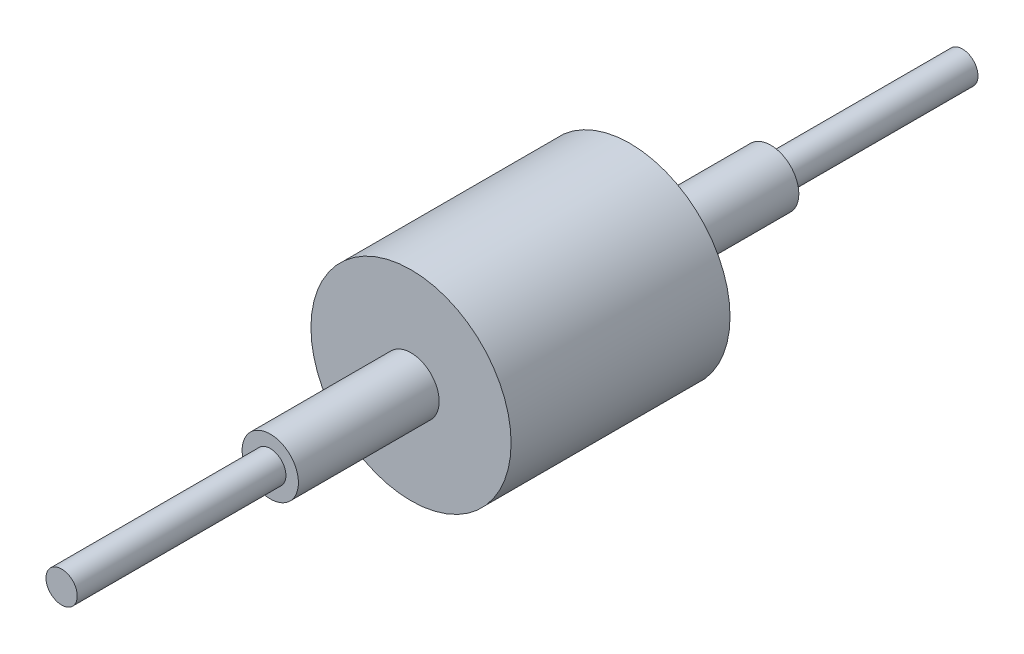
ISO-10303-21;
HEADER;
FILE_DESCRIPTION(('STEP AP214'),'2;1');
FILE_NAME('part.step','',(''),(''),'','','');
FILE_SCHEMA(('AUTOMOTIVE_DESIGN { 1 0 10303 214 1 1 1 1 }'));
ENDSEC;
DATA;
#1=APPLICATION_CONTEXT('core data for automotive mechanical design processes');
#2=APPLICATION_PROTOCOL_DEFINITION('international standard','automotive_design',2000,#1);
#3=PRODUCT_CONTEXT('',#1,'mechanical');
#4=PRODUCT('Part','Part','',(#3));
#5=PRODUCT_RELATED_PRODUCT_CATEGORY('part','',(#4));
#6=PRODUCT_DEFINITION_FORMATION('','',#4);
#7=PRODUCT_DEFINITION_CONTEXT('part definition',#1,'design');
#8=PRODUCT_DEFINITION('design','',#6,#7);
#9=PRODUCT_DEFINITION_SHAPE('','',#8);
#10=(LENGTH_UNIT() NAMED_UNIT(*) SI_UNIT(.MILLI.,.METRE.));
#11=(NAMED_UNIT(*) PLANE_ANGLE_UNIT() SI_UNIT($,.RADIAN.));
#12=(NAMED_UNIT(*) SI_UNIT($,.STERADIAN.) SOLID_ANGLE_UNIT());
#13=UNCERTAINTY_MEASURE_WITH_UNIT(LENGTH_MEASURE(1.E-05),#10,'distance_accuracy_value','');
#14=(GEOMETRIC_REPRESENTATION_CONTEXT(3) GLOBAL_UNCERTAINTY_ASSIGNED_CONTEXT((#13)) GLOBAL_UNIT_ASSIGNED_CONTEXT((#10,
#11,#12)) REPRESENTATION_CONTEXT('',''));
#15=CARTESIAN_POINT('',(0.,0.,0.));
#16=DIRECTION('',(0.,0.,1.));
#17=DIRECTION('',(1.,0.,0.));
#18=AXIS2_PLACEMENT_3D('',#15,#16,#17);
#19=CARTESIAN_POINT('',(3.571875,0.,-4.35704555792125));
#20=DIRECTION('',(0.,0.,-1.));
#21=DIRECTION('',(-1.,0.,0.));
#22=AXIS2_PLACEMENT_3D('',#19,#20,#21);
#23=PLANE('',#22);
#24=CARTESIAN_POINT('',(0.,0.,-4.35704555792116));
#25=DIRECTION('',(0.,0.,1.));
#26=DIRECTION('',(1.,0.,0.));
#27=AXIS2_PLACEMENT_3D('',#24,#25,#26);
#28=CIRCLE('',#27,3.57187500000001);
#29=CARTESIAN_POINT('',(3.571875,0.,-4.35704555792117));
#30=VERTEX_POINT('',#29);
#31=EDGE_CURVE('E10',#30,#30,#28,.T.);
#32=ORIENTED_EDGE('',*,*,#31,.T.);
#33=EDGE_LOOP('',(#32));
#34=FACE_BOUND('',#33,.T.);
#35=CARTESIAN_POINT('',(0.,0.,-4.35704555792116));
#36=DIRECTION('',(0.,0.,1.));
#37=DIRECTION('',(1.,0.,0.));
#38=AXIS2_PLACEMENT_3D('',#35,#36,#37);
#39=CIRCLE('',#38,12.7);
#40=CARTESIAN_POINT('',(12.7,0.,-4.3570455579212));
#41=VERTEX_POINT('',#40);
#42=EDGE_CURVE('E66',#41,#41,#39,.T.);
#43=ORIENTED_EDGE('',*,*,#42,.F.);
#44=EDGE_LOOP('',(#43));
#45=FACE_BOUND('',#44,.T.);
#46=ADVANCED_FACE('F32',(#34,#45),#23,.T.);
#47=CARTESIAN_POINT('',(3.49495078579509E-12,0.,1000.));
#48=DIRECTION('',(0.,0.,1.));
#49=DIRECTION('',(1.,0.,0.));
#50=AXIS2_PLACEMENT_3D('',#47,#48,#49);
#51=CYLINDRICAL_SURFACE('',#50,3.57187500000004);
#52=CARTESIAN_POINT('',(0.,0.,-22.2164205579212));
#53=DIRECTION('',(0.,0.,1.));
#54=DIRECTION('',(1.,0.,0.));
#55=AXIS2_PLACEMENT_3D('',#52,#53,#54);
#56=CIRCLE('',#55,3.57187500000007);
#57=CARTESIAN_POINT('',(3.571875,0.,-22.2164205579212));
#58=VERTEX_POINT('',#57);
#59=EDGE_CURVE('E38',#58,#58,#56,.T.);
#60=ORIENTED_EDGE('',*,*,#59,.T.);
#61=EDGE_LOOP('',(#60));
#62=FACE_BOUND('',#61,.T.);
#63=ORIENTED_EDGE('',*,*,#31,.F.);
#64=EDGE_LOOP('',(#63));
#65=FACE_BOUND('',#64,.T.);
#66=ADVANCED_FACE('F74',(#62,#65),#51,.T.);
#67=CARTESIAN_POINT('',(1.98437499999673,0.,-22.2164205579213));
#68=DIRECTION('',(0.,0.,-1.));
#69=DIRECTION('',(-1.,0.,0.));
#70=AXIS2_PLACEMENT_3D('',#67,#68,#69);
#71=PLANE('',#70);
#72=CARTESIAN_POINT('',(0.,0.,-22.2164205579212));
#73=DIRECTION('',(0.,0.,1.));
#74=DIRECTION('',(1.,0.,0.));
#75=AXIS2_PLACEMENT_3D('',#72,#73,#74);
#76=CIRCLE('',#75,1.9843749999968);
#77=CARTESIAN_POINT('',(1.98437499999673,0.,-22.2164205579212));
#78=VERTEX_POINT('',#77);
#79=EDGE_CURVE('E42',#78,#78,#76,.T.);
#80=ORIENTED_EDGE('',*,*,#79,.T.);
#81=EDGE_LOOP('',(#80));
#82=FACE_BOUND('',#81,.T.);
#83=ORIENTED_EDGE('',*,*,#59,.F.);
#84=EDGE_LOOP('',(#83));
#85=FACE_BOUND('',#84,.T.);
#86=ADVANCED_FACE('F78',(#82,#85),#71,.T.);
#87=CARTESIAN_POINT('',(3.49495078579509E-12,0.,1000.));
#88=DIRECTION('',(0.,0.,1.));
#89=DIRECTION('',(1.,0.,0.));
#90=AXIS2_PLACEMENT_3D('',#87,#88,#89);
#91=CYLINDRICAL_SURFACE('',#90,1.98437499999685);
#92=CARTESIAN_POINT('',(-1.59016779902279E-13,0.,-46.5379049993924));
#93=DIRECTION('',(0.,0.,1.));
#94=DIRECTION('',(1.,0.,0.));
#95=AXIS2_PLACEMENT_3D('',#92,#93,#94);
#96=CIRCLE('',#95,1.9843749999969);
#97=CARTESIAN_POINT('',(1.98437499999674,0.,-46.5379049993924));
#98=VERTEX_POINT('',#97);
#99=EDGE_CURVE('E46',#98,#98,#96,.T.);
#100=ORIENTED_EDGE('',*,*,#99,.T.);
#101=EDGE_LOOP('',(#100));
#102=FACE_BOUND('',#101,.T.);
#103=ORIENTED_EDGE('',*,*,#79,.F.);
#104=EDGE_LOOP('',(#103));
#105=FACE_BOUND('',#104,.T.);
#106=ADVANCED_FACE('F82',(#102,#105),#91,.T.);
#107=CARTESIAN_POINT('',(1.98437499999674,0.,-46.5379049993923));
#108=DIRECTION('',(0.,0.,-1.));
#109=DIRECTION('',(-1.,0.,0.));
#110=AXIS2_PLACEMENT_3D('',#107,#108,#109);
#111=PLANE('',#110);
#112=ORIENTED_EDGE('',*,*,#99,.F.);
#113=EDGE_LOOP('',(#112));
#114=FACE_BOUND('',#113,.T.);
#115=ADVANCED_FACE('F89',(#114),#111,.T.);
#116=CARTESIAN_POINT('',(0.,0.,67.7620950006077));
#117=DIRECTION('',(0.,0.,1.));
#118=DIRECTION('',(1.,0.,0.));
#119=AXIS2_PLACEMENT_3D('',#116,#117,#118);
#120=PLANE('',#119);
#121=CARTESIAN_POINT('',(2.40059537127491E-13,0.,67.7620950006077));
#122=DIRECTION('',(0.,0.,1.));
#123=DIRECTION('',(1.,0.,0.));
#124=AXIS2_PLACEMENT_3D('',#121,#122,#123);
#125=CIRCLE('',#124,1.98437499999977);
#126=CARTESIAN_POINT('',(1.98437500000001,0.,67.7620950006077));
#127=VERTEX_POINT('',#126);
#128=EDGE_CURVE('E51',#127,#127,#125,.T.);
#129=ORIENTED_EDGE('',*,*,#128,.T.);
#130=EDGE_LOOP('',(#129));
#131=FACE_BOUND('',#130,.T.);
#132=ADVANCED_FACE('F93',(#131),#120,.T.);
#133=CARTESIAN_POINT('',(3.49495078579509E-12,0.,1000.));
#134=DIRECTION('',(0.,0.,1.));
#135=DIRECTION('',(1.,0.,0.));
#136=AXIS2_PLACEMENT_3D('',#133,#134,#135);
#137=CYLINDRICAL_SURFACE('',#136,1.98437499999982);
#138=CARTESIAN_POINT('',(1.4761029417462E-13,0.,41.2835794420787));
#139=DIRECTION('',(0.,0.,1.));
#140=DIRECTION('',(1.,0.,0.));
#141=AXIS2_PLACEMENT_3D('',#138,#139,#140);
#142=CIRCLE('',#141,1.98437499999986);
#143=CARTESIAN_POINT('',(1.98437500000001,0.,41.2835794420787));
#144=VERTEX_POINT('',#143);
#145=EDGE_CURVE('E54',#144,#144,#142,.T.);
#146=ORIENTED_EDGE('',*,*,#145,.T.);
#147=EDGE_LOOP('',(#146));
#148=FACE_BOUND('',#147,.T.);
#149=ORIENTED_EDGE('',*,*,#128,.F.);
#150=EDGE_LOOP('',(#149));
#151=FACE_BOUND('',#150,.T.);
#152=ADVANCED_FACE('F97',(#148,#151),#137,.T.);
#153=CARTESIAN_POINT('',(1.98437500000001,0.,41.2835794420787));
#154=DIRECTION('',(0.,0.,1.));
#155=DIRECTION('',(1.,0.,0.));
#156=AXIS2_PLACEMENT_3D('',#153,#154,#155);
#157=PLANE('',#156);
#158=CARTESIAN_POINT('',(1.4761029417462E-13,0.,41.2835794420787));
#159=DIRECTION('',(0.,0.,1.));
#160=DIRECTION('',(1.,0.,0.));
#161=AXIS2_PLACEMENT_3D('',#158,#159,#160);
#162=CIRCLE('',#161,3.57187499999985);
#163=CARTESIAN_POINT('',(3.571875,0.,41.2835794420787));
#164=VERTEX_POINT('',#163);
#165=EDGE_CURVE('E57',#164,#164,#162,.T.);
#166=ORIENTED_EDGE('',*,*,#165,.T.);
#167=EDGE_LOOP('',(#166));
#168=FACE_BOUND('',#167,.T.);
#169=ORIENTED_EDGE('',*,*,#145,.F.);
#170=EDGE_LOOP('',(#169));
#171=FACE_BOUND('',#170,.T.);
#172=ADVANCED_FACE('F101',(#168,#171),#157,.T.);
#173=CARTESIAN_POINT('',(3.49495078579509E-12,0.,1000.));
#174=DIRECTION('',(0.,0.,1.));
#175=DIRECTION('',(1.,0.,0.));
#176=AXIS2_PLACEMENT_3D('',#173,#174,#175);
#177=CYLINDRICAL_SURFACE('',#176,3.57187499999988);
#178=CARTESIAN_POINT('',(0.,0.,23.4242044420787));
#179=DIRECTION('',(0.,0.,1.));
#180=DIRECTION('',(1.,0.,0.));
#181=AXIS2_PLACEMENT_3D('',#178,#179,#180);
#182=CIRCLE('',#181,3.57187499999991);
#183=CARTESIAN_POINT('',(3.571875,0.,23.4242044420787));
#184=VERTEX_POINT('',#183);
#185=EDGE_CURVE('E60',#184,#184,#182,.T.);
#186=ORIENTED_EDGE('',*,*,#185,.T.);
#187=EDGE_LOOP('',(#186));
#188=FACE_BOUND('',#187,.T.);
#189=ORIENTED_EDGE('',*,*,#165,.F.);
#190=EDGE_LOOP('',(#189));
#191=FACE_BOUND('',#190,.T.);
#192=ADVANCED_FACE('F105',(#188,#191),#177,.T.);
#193=CARTESIAN_POINT('',(3.571875,0.,23.4242044420788));
#194=DIRECTION('',(0.,0.,1.));
#195=DIRECTION('',(1.,0.,0.));
#196=AXIS2_PLACEMENT_3D('',#193,#194,#195);
#197=PLANE('',#196);
#198=CARTESIAN_POINT('',(0.,0.,23.4242044420787));
#199=DIRECTION('',(0.,0.,1.));
#200=DIRECTION('',(1.,0.,0.));
#201=AXIS2_PLACEMENT_3D('',#198,#199,#200);
#202=CIRCLE('',#201,12.6999999999999);
#203=CARTESIAN_POINT('',(12.7,0.,23.4242044420787));
#204=VERTEX_POINT('',#203);
#205=EDGE_CURVE('E63',#204,#204,#202,.T.);
#206=ORIENTED_EDGE('',*,*,#205,.T.);
#207=EDGE_LOOP('',(#206));
#208=FACE_BOUND('',#207,.T.);
#209=ORIENTED_EDGE('',*,*,#185,.F.);
#210=EDGE_LOOP('',(#209));
#211=FACE_BOUND('',#210,.T.);
#212=ADVANCED_FACE('F109',(#208,#211),#197,.T.);
#213=CARTESIAN_POINT('',(3.49495078579509E-12,0.,1000.));
#214=DIRECTION('',(0.,0.,1.));
#215=DIRECTION('',(1.,0.,0.));
#216=AXIS2_PLACEMENT_3D('',#213,#214,#215);
#217=CYLINDRICAL_SURFACE('',#216,12.7);
#218=ORIENTED_EDGE('',*,*,#42,.T.);
#219=EDGE_LOOP('',(#218));
#220=FACE_BOUND('',#219,.T.);
#221=ORIENTED_EDGE('',*,*,#205,.F.);
#222=EDGE_LOOP('',(#221));
#223=FACE_BOUND('',#222,.T.);
#224=ADVANCED_FACE('F70',(#220,#223),#217,.T.);
#225=CLOSED_SHELL('',(#46,#66,#86,#106,#115,#132,#152,#172,#192,#212,#224));
#226=MANIFOLD_SOLID_BREP('B2',#225);
#227=ADVANCED_BREP_SHAPE_REPRESENTATION('',(#18,#226),#14);
#228=SHAPE_DEFINITION_REPRESENTATION(#9,#227);
ENDSEC;
END-ISO-10303-21;
